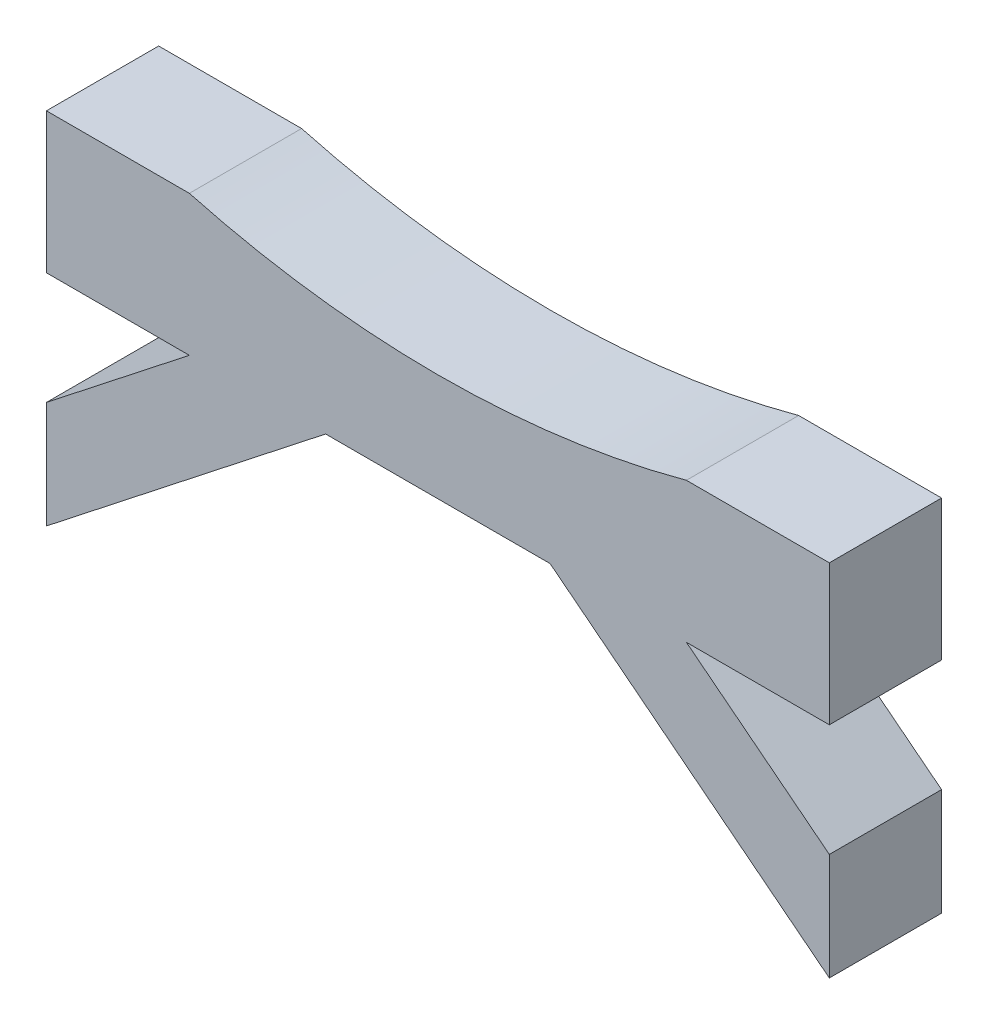
ISO-10303-21;
HEADER;
FILE_DESCRIPTION(('STEP AP214'),'2;1');
FILE_NAME('part.step','',(''),(''),'','','');
FILE_SCHEMA(('AUTOMOTIVE_DESIGN { 1 0 10303 214 1 1 1 1 }'));
ENDSEC;
DATA;
#1=APPLICATION_CONTEXT('core data for automotive mechanical design processes');
#2=APPLICATION_PROTOCOL_DEFINITION('international standard','automotive_design',2000,#1);
#3=PRODUCT_CONTEXT('',#1,'mechanical');
#4=PRODUCT('Part','Part','',(#3));
#5=PRODUCT_RELATED_PRODUCT_CATEGORY('part','',(#4));
#6=PRODUCT_DEFINITION_FORMATION('','',#4);
#7=PRODUCT_DEFINITION_CONTEXT('part definition',#1,'design');
#8=PRODUCT_DEFINITION('design','',#6,#7);
#9=PRODUCT_DEFINITION_SHAPE('','',#8);
#10=(LENGTH_UNIT() NAMED_UNIT(*) SI_UNIT(.MILLI.,.METRE.));
#11=(NAMED_UNIT(*) PLANE_ANGLE_UNIT() SI_UNIT($,.RADIAN.));
#12=(NAMED_UNIT(*) SI_UNIT($,.STERADIAN.) SOLID_ANGLE_UNIT());
#13=UNCERTAINTY_MEASURE_WITH_UNIT(LENGTH_MEASURE(1.E-05),#10,'distance_accuracy_value','');
#14=(GEOMETRIC_REPRESENTATION_CONTEXT(3) GLOBAL_UNCERTAINTY_ASSIGNED_CONTEXT((#13)) GLOBAL_UNIT_ASSIGNED_CONTEXT((#10,
#11,#12)) REPRESENTATION_CONTEXT('',''));
#15=CARTESIAN_POINT('',(0.,0.,0.));
#16=DIRECTION('',(0.,0.,1.));
#17=DIRECTION('',(1.,0.,0.));
#18=AXIS2_PLACEMENT_3D('',#15,#16,#17);
#19=CARTESIAN_POINT('',(0.,0.,5.08));
#20=DIRECTION('',(1.,0.,0.));
#21=DIRECTION('',(0.,0.,-1.));
#22=AXIS2_PLACEMENT_3D('',#19,#20,#21);
#23=PLANE('',#22);
#24=DIRECTION('',(0.,-1.,0.));
#25=VECTOR('',#24,1.);
#26=CARTESIAN_POINT('',(0.,0.,0.));
#27=LINE('',#26,#25);
#28=CARTESIAN_POINT('',(0.,6.35,0.));
#29=VERTEX_POINT('',#28);
#30=CARTESIAN_POINT('',(0.,0.,0.));
#31=VERTEX_POINT('',#30);
#32=EDGE_CURVE('E171',#29,#31,#27,.T.);
#33=ORIENTED_EDGE('',*,*,#32,.T.);
#34=DIRECTION('',(0.,0.,-1.));
#35=VECTOR('',#34,1.);
#36=CARTESIAN_POINT('',(0.,0.,5.08));
#37=LINE('',#36,#35);
#38=CARTESIAN_POINT('',(0.,0.,5.08));
#39=VERTEX_POINT('',#38);
#40=EDGE_CURVE('E11',#39,#31,#37,.T.);
#41=ORIENTED_EDGE('',*,*,#40,.F.);
#42=DIRECTION('',(0.,-1.,0.));
#43=VECTOR('',#42,1.);
#44=CARTESIAN_POINT('',(0.,0.,5.08));
#45=LINE('',#44,#43);
#46=CARTESIAN_POINT('',(0.,6.35,5.08));
#47=VERTEX_POINT('',#46);
#48=EDGE_CURVE('E197',#47,#39,#45,.T.);
#49=ORIENTED_EDGE('',*,*,#48,.F.);
#50=DIRECTION('',(0.,0.,-1.));
#51=VECTOR('',#50,1.);
#52=CARTESIAN_POINT('',(0.,6.35,5.08));
#53=LINE('',#52,#51);
#54=EDGE_CURVE('E167',#47,#29,#53,.T.);
#55=ORIENTED_EDGE('',*,*,#54,.T.);
#56=EDGE_LOOP('',(#33,#41,#49,#55));
#57=FACE_BOUND('',#56,.T.);
#58=ADVANCED_FACE('F39',(#57),#23,.F.);
#59=CARTESIAN_POINT('',(0.,0.,5.08));
#60=DIRECTION('',(0.,1.,0.));
#61=DIRECTION('',(0.,0.,1.));
#62=AXIS2_PLACEMENT_3D('',#59,#60,#61);
#63=PLANE('',#62);
#64=DIRECTION('',(1.,0.,0.));
#65=VECTOR('',#64,1.);
#66=CARTESIAN_POINT('',(0.,0.,0.));
#67=LINE('',#66,#65);
#68=CARTESIAN_POINT('',(6.46865976501453,0.,0.));
#69=VERTEX_POINT('',#68);
#70=EDGE_CURVE('E174',#31,#69,#67,.T.);
#71=ORIENTED_EDGE('',*,*,#70,.T.);
#72=DIRECTION('',(0.,0.,-1.));
#73=VECTOR('',#72,1.);
#74=CARTESIAN_POINT('',(6.46865976501453,0.,5.08));
#75=LINE('',#74,#73);
#76=CARTESIAN_POINT('',(6.46865976501453,0.,5.08));
#77=VERTEX_POINT('',#76);
#78=EDGE_CURVE('E47',#77,#69,#75,.T.);
#79=ORIENTED_EDGE('',*,*,#78,.F.);
#80=DIRECTION('',(1.,0.,0.));
#81=VECTOR('',#80,1.);
#82=CARTESIAN_POINT('',(0.,0.,5.08));
#83=LINE('',#82,#81);
#84=EDGE_CURVE('E116',#39,#77,#83,.T.);
#85=ORIENTED_EDGE('',*,*,#84,.F.);
#86=ORIENTED_EDGE('',*,*,#40,.T.);
#87=EDGE_LOOP('',(#71,#79,#85,#86));
#88=FACE_BOUND('',#87,.T.);
#89=ADVANCED_FACE('F285',(#88),#63,.F.);
#90=CARTESIAN_POINT('',(6.46865976501453,0.,5.08));
#91=DIRECTION('',(0.617632218830328,-0.786467063685903,0.));
#92=DIRECTION('',(0.786467063685903,0.617632218830328,0.));
#93=AXIS2_PLACEMENT_3D('',#90,#91,#92);
#94=PLANE('',#93);
#95=DIRECTION('',(-0.786467063685903,-0.617632218830328,0.));
#96=VECTOR('',#95,1.);
#97=CARTESIAN_POINT('',(6.46865976501453,0.,0.));
#98=LINE('',#97,#96);
#99=CARTESIAN_POINT('',(0.,-5.08,0.));
#100=VERTEX_POINT('',#99);
#101=EDGE_CURVE('E176',#69,#100,#98,.T.);
#102=ORIENTED_EDGE('',*,*,#101,.T.);
#103=DIRECTION('',(0.,0.,-1.));
#104=VECTOR('',#103,1.);
#105=CARTESIAN_POINT('',(0.,-5.08,5.08));
#106=LINE('',#105,#104);
#107=CARTESIAN_POINT('',(0.,-5.08,5.08));
#108=VERTEX_POINT('',#107);
#109=EDGE_CURVE('E222',#108,#100,#106,.T.);
#110=ORIENTED_EDGE('',*,*,#109,.F.);
#111=DIRECTION('',(-0.786467063685903,-0.617632218830328,0.));
#112=VECTOR('',#111,1.);
#113=CARTESIAN_POINT('',(6.46865976501453,0.,5.08));
#114=LINE('',#113,#112);
#115=EDGE_CURVE('E230',#77,#108,#114,.T.);
#116=ORIENTED_EDGE('',*,*,#115,.F.);
#117=ORIENTED_EDGE('',*,*,#78,.T.);
#118=EDGE_LOOP('',(#102,#110,#116,#117));
#119=FACE_BOUND('',#118,.T.);
#120=ADVANCED_FACE('F228',(#119),#94,.F.);
#121=CARTESIAN_POINT('',(0.,-5.08,5.08));
#122=DIRECTION('',(1.,0.,0.));
#123=DIRECTION('',(0.,1.,0.));
#124=AXIS2_PLACEMENT_3D('',#121,#122,#123);
#125=PLANE('',#124);
#126=DIRECTION('',(0.,-1.,0.));
#127=VECTOR('',#126,1.);
#128=CARTESIAN_POINT('',(0.,-5.08,0.));
#129=LINE('',#128,#127);
#130=CARTESIAN_POINT('',(0.,-9.92444953377174,0.));
#131=VERTEX_POINT('',#130);
#132=EDGE_CURVE('E178',#100,#131,#129,.T.);
#133=ORIENTED_EDGE('',*,*,#132,.T.);
#134=DIRECTION('',(0.,0.,-1.));
#135=VECTOR('',#134,1.);
#136=CARTESIAN_POINT('',(0.,-9.92444953377174,5.08));
#137=LINE('',#136,#135);
#138=CARTESIAN_POINT('',(0.,-9.92444953377174,5.08));
#139=VERTEX_POINT('',#138);
#140=EDGE_CURVE('E219',#139,#131,#137,.T.);
#141=ORIENTED_EDGE('',*,*,#140,.F.);
#142=DIRECTION('',(0.,-1.,0.));
#143=VECTOR('',#142,1.);
#144=CARTESIAN_POINT('',(0.,-5.08,5.08));
#145=LINE('',#144,#143);
#146=EDGE_CURVE('E248',#108,#139,#145,.T.);
#147=ORIENTED_EDGE('',*,*,#146,.F.);
#148=ORIENTED_EDGE('',*,*,#109,.T.);
#149=EDGE_LOOP('',(#133,#141,#147,#148));
#150=FACE_BOUND('',#149,.T.);
#151=ADVANCED_FACE('F239',(#150),#125,.F.);
#152=CARTESIAN_POINT('',(0.,-9.92444953377174,5.08));
#153=DIRECTION('',(-0.617632218830328,0.786467063685903,0.));
#154=DIRECTION('',(-0.786467063685903,-0.617632218830328,0.));
#155=AXIS2_PLACEMENT_3D('',#152,#153,#154);
#156=PLANE('',#155);
#157=DIRECTION('',(0.786467063685903,0.617632218830327,0.));
#158=VECTOR('',#157,1.);
#159=CARTESIAN_POINT('',(0.,-9.92444953377174,0.));
#160=LINE('',#159,#158);
#161=CARTESIAN_POINT('',(12.6373794072887,0.,0.));
#162=VERTEX_POINT('',#161);
#163=EDGE_CURVE('E180',#131,#162,#160,.T.);
#164=ORIENTED_EDGE('',*,*,#163,.T.);
#165=DIRECTION('',(0.,0.,-1.));
#166=VECTOR('',#165,1.);
#167=CARTESIAN_POINT('',(12.6373794072887,0.,5.08));
#168=LINE('',#167,#166);
#169=CARTESIAN_POINT('',(12.6373794072887,0.,5.08));
#170=VERTEX_POINT('',#169);
#171=EDGE_CURVE('E216',#170,#162,#168,.T.);
#172=ORIENTED_EDGE('',*,*,#171,.F.);
#173=DIRECTION('',(0.786467063685903,0.617632218830327,0.));
#174=VECTOR('',#173,1.);
#175=CARTESIAN_POINT('',(0.,-9.92444953377174,5.08));
#176=LINE('',#175,#174);
#177=EDGE_CURVE('E245',#139,#170,#176,.T.);
#178=ORIENTED_EDGE('',*,*,#177,.F.);
#179=ORIENTED_EDGE('',*,*,#140,.T.);
#180=EDGE_LOOP('',(#164,#172,#178,#179));
#181=FACE_BOUND('',#180,.T.);
#182=ADVANCED_FACE('F243',(#181),#156,.F.);
#183=CARTESIAN_POINT('',(12.6373794072887,0.,5.08));
#184=DIRECTION('',(0.,1.,0.));
#185=DIRECTION('',(0.,0.,1.));
#186=AXIS2_PLACEMENT_3D('',#183,#184,#185);
#187=PLANE('',#186);
#188=DIRECTION('',(1.,0.,0.));
#189=VECTOR('',#188,1.);
#190=CARTESIAN_POINT('',(12.6373794072887,0.,0.));
#191=LINE('',#190,#189);
#192=CARTESIAN_POINT('',(22.7973794072887,0.,0.));
#193=VERTEX_POINT('',#192);
#194=EDGE_CURVE('E182',#162,#193,#191,.T.);
#195=ORIENTED_EDGE('',*,*,#194,.T.);
#196=DIRECTION('',(0.,0.,-1.));
#197=VECTOR('',#196,1.);
#198=CARTESIAN_POINT('',(22.7973794072887,0.,5.08));
#199=LINE('',#198,#197);
#200=CARTESIAN_POINT('',(22.7973794072887,0.,5.08));
#201=VERTEX_POINT('',#200);
#202=EDGE_CURVE('E213',#201,#193,#199,.T.);
#203=ORIENTED_EDGE('',*,*,#202,.F.);
#204=DIRECTION('',(1.,0.,0.));
#205=VECTOR('',#204,1.);
#206=CARTESIAN_POINT('',(12.6373794072887,0.,5.08));
#207=LINE('',#206,#205);
#208=EDGE_CURVE('E247',#170,#201,#207,.T.);
#209=ORIENTED_EDGE('',*,*,#208,.F.);
#210=ORIENTED_EDGE('',*,*,#171,.T.);
#211=EDGE_LOOP('',(#195,#203,#209,#210));
#212=FACE_BOUND('',#211,.T.);
#213=ADVANCED_FACE('F298',(#212),#187,.F.);
#214=CARTESIAN_POINT('',(35.4347588145773,-9.92444953377174,5.08));
#215=DIRECTION('',(0.617632218830327,0.786467063685903,0.));
#216=DIRECTION('',(-0.786467063685903,0.617632218830327,0.));
#217=AXIS2_PLACEMENT_3D('',#214,#215,#216);
#218=PLANE('',#217);
#219=DIRECTION('',(0.786467063685903,-0.617632218830328,0.));
#220=VECTOR('',#219,1.);
#221=CARTESIAN_POINT('',(35.4347588145773,-9.92444953377174,0.));
#222=LINE('',#221,#220);
#223=CARTESIAN_POINT('',(35.4347588145773,-9.92444953377174,0.));
#224=VERTEX_POINT('',#223);
#225=EDGE_CURVE('E184',#193,#224,#222,.T.);
#226=ORIENTED_EDGE('',*,*,#225,.T.);
#227=DIRECTION('',(0.,0.,-1.));
#228=VECTOR('',#227,1.);
#229=CARTESIAN_POINT('',(35.4347588145773,-9.92444953377174,5.08));
#230=LINE('',#229,#228);
#231=CARTESIAN_POINT('',(35.4347588145773,-9.92444953377174,5.08));
#232=VERTEX_POINT('',#231);
#233=EDGE_CURVE('E210',#232,#224,#230,.T.);
#234=ORIENTED_EDGE('',*,*,#233,.F.);
#235=DIRECTION('',(0.786467063685903,-0.617632218830328,0.));
#236=VECTOR('',#235,1.);
#237=CARTESIAN_POINT('',(35.4347588145773,-9.92444953377174,5.08));
#238=LINE('',#237,#236);
#239=EDGE_CURVE('E250',#201,#232,#238,.T.);
#240=ORIENTED_EDGE('',*,*,#239,.F.);
#241=ORIENTED_EDGE('',*,*,#202,.T.);
#242=EDGE_LOOP('',(#226,#234,#240,#241));
#243=FACE_BOUND('',#242,.T.);
#244=ADVANCED_FACE('F301',(#243),#218,.F.);
#245=CARTESIAN_POINT('',(35.4347588145773,-5.08,5.08));
#246=DIRECTION('',(-1.,0.,0.));
#247=DIRECTION('',(0.,0.,1.));
#248=AXIS2_PLACEMENT_3D('',#245,#246,#247);
#249=PLANE('',#248);
#250=DIRECTION('',(0.,1.,0.));
#251=VECTOR('',#250,1.);
#252=CARTESIAN_POINT('',(35.4347588145773,-5.08,0.));
#253=LINE('',#252,#251);
#254=CARTESIAN_POINT('',(35.4347588145773,-5.08,0.));
#255=VERTEX_POINT('',#254);
#256=EDGE_CURVE('E186',#224,#255,#253,.T.);
#257=ORIENTED_EDGE('',*,*,#256,.T.);
#258=DIRECTION('',(0.,0.,-1.));
#259=VECTOR('',#258,1.);
#260=CARTESIAN_POINT('',(35.4347588145773,-5.08,5.08));
#261=LINE('',#260,#259);
#262=CARTESIAN_POINT('',(35.4347588145773,-5.08,5.08));
#263=VERTEX_POINT('',#262);
#264=EDGE_CURVE('E207',#263,#255,#261,.T.);
#265=ORIENTED_EDGE('',*,*,#264,.F.);
#266=DIRECTION('',(0.,1.,0.));
#267=VECTOR('',#266,1.);
#268=CARTESIAN_POINT('',(35.4347588145773,-5.08,5.08));
#269=LINE('',#268,#267);
#270=EDGE_CURVE('E256',#232,#263,#269,.T.);
#271=ORIENTED_EDGE('',*,*,#270,.F.);
#272=ORIENTED_EDGE('',*,*,#233,.T.);
#273=EDGE_LOOP('',(#257,#265,#271,#272));
#274=FACE_BOUND('',#273,.T.);
#275=ADVANCED_FACE('F305',(#274),#249,.F.);
#276=CARTESIAN_POINT('',(28.9660990495628,0.,5.08));
#277=DIRECTION('',(-0.617632218830328,-0.786467063685903,0.));
#278=DIRECTION('',(0.786467063685903,-0.617632218830328,0.));
#279=AXIS2_PLACEMENT_3D('',#276,#277,#278);
#280=PLANE('',#279);
#281=DIRECTION('',(-0.786467063685903,0.617632218830328,0.));
#282=VECTOR('',#281,1.);
#283=CARTESIAN_POINT('',(28.9660990495628,0.,0.));
#284=LINE('',#283,#282);
#285=CARTESIAN_POINT('',(28.9660990495628,0.,0.));
#286=VERTEX_POINT('',#285);
#287=EDGE_CURVE('E188',#255,#286,#284,.T.);
#288=ORIENTED_EDGE('',*,*,#287,.T.);
#289=DIRECTION('',(0.,0.,-1.));
#290=VECTOR('',#289,1.);
#291=CARTESIAN_POINT('',(28.9660990495628,0.,5.08));
#292=LINE('',#291,#290);
#293=CARTESIAN_POINT('',(28.9660990495628,0.,5.08));
#294=VERTEX_POINT('',#293);
#295=EDGE_CURVE('E204',#294,#286,#292,.T.);
#296=ORIENTED_EDGE('',*,*,#295,.F.);
#297=DIRECTION('',(-0.786467063685903,0.617632218830328,0.));
#298=VECTOR('',#297,1.);
#299=CARTESIAN_POINT('',(28.9660990495628,0.,5.08));
#300=LINE('',#299,#298);
#301=EDGE_CURVE('E258',#263,#294,#300,.T.);
#302=ORIENTED_EDGE('',*,*,#301,.F.);
#303=ORIENTED_EDGE('',*,*,#264,.T.);
#304=EDGE_LOOP('',(#288,#296,#302,#303));
#305=FACE_BOUND('',#304,.T.);
#306=ADVANCED_FACE('F309',(#305),#280,.F.);
#307=CARTESIAN_POINT('',(35.4347588145773,0.,5.08));
#308=DIRECTION('',(0.,1.,0.));
#309=DIRECTION('',(0.,0.,1.));
#310=AXIS2_PLACEMENT_3D('',#307,#308,#309);
#311=PLANE('',#310);
#312=DIRECTION('',(1.,0.,0.));
#313=VECTOR('',#312,1.);
#314=CARTESIAN_POINT('',(35.4347588145773,0.,0.));
#315=LINE('',#314,#313);
#316=CARTESIAN_POINT('',(35.4347588145773,0.,0.));
#317=VERTEX_POINT('',#316);
#318=EDGE_CURVE('E190',#286,#317,#315,.T.);
#319=ORIENTED_EDGE('',*,*,#318,.T.);
#320=DIRECTION('',(0.,0.,-1.));
#321=VECTOR('',#320,1.);
#322=CARTESIAN_POINT('',(35.4347588145773,0.,5.08));
#323=LINE('',#322,#321);
#324=CARTESIAN_POINT('',(35.4347588145773,0.,5.08));
#325=VERTEX_POINT('',#324);
#326=EDGE_CURVE('E201',#325,#317,#323,.T.);
#327=ORIENTED_EDGE('',*,*,#326,.F.);
#328=DIRECTION('',(1.,0.,0.));
#329=VECTOR('',#328,1.);
#330=CARTESIAN_POINT('',(35.4347588145773,0.,5.08));
#331=LINE('',#330,#329);
#332=EDGE_CURVE('E260',#294,#325,#331,.T.);
#333=ORIENTED_EDGE('',*,*,#332,.F.);
#334=ORIENTED_EDGE('',*,*,#295,.T.);
#335=EDGE_LOOP('',(#319,#327,#333,#334));
#336=FACE_BOUND('',#335,.T.);
#337=ADVANCED_FACE('F266',(#336),#311,.F.);
#338=CARTESIAN_POINT('',(35.4347588145773,0.,5.08));
#339=DIRECTION('',(-1.,0.,0.));
#340=DIRECTION('',(0.,0.,1.));
#341=AXIS2_PLACEMENT_3D('',#338,#339,#340);
#342=PLANE('',#341);
#343=DIRECTION('',(0.,1.,0.));
#344=VECTOR('',#343,1.);
#345=CARTESIAN_POINT('',(35.4347588145773,0.,0.));
#346=LINE('',#345,#344);
#347=CARTESIAN_POINT('',(35.4347588145773,6.35,0.));
#348=VERTEX_POINT('',#347);
#349=EDGE_CURVE('E192',#317,#348,#346,.T.);
#350=ORIENTED_EDGE('',*,*,#349,.T.);
#351=DIRECTION('',(0.,0.,-1.));
#352=VECTOR('',#351,1.);
#353=CARTESIAN_POINT('',(35.4347588145773,6.35,5.08));
#354=LINE('',#353,#352);
#355=CARTESIAN_POINT('',(35.4347588145773,6.35,5.08));
#356=VERTEX_POINT('',#355);
#357=EDGE_CURVE('E162',#356,#348,#354,.T.);
#358=ORIENTED_EDGE('',*,*,#357,.F.);
#359=DIRECTION('',(0.,1.,0.));
#360=VECTOR('',#359,1.);
#361=CARTESIAN_POINT('',(35.4347588145773,0.,5.08));
#362=LINE('',#361,#360);
#363=EDGE_CURVE('E153',#325,#356,#362,.T.);
#364=ORIENTED_EDGE('',*,*,#363,.F.);
#365=ORIENTED_EDGE('',*,*,#326,.T.);
#366=EDGE_LOOP('',(#350,#358,#364,#365));
#367=FACE_BOUND('',#366,.T.);
#368=ADVANCED_FACE('F270',(#367),#342,.F.);
#369=CARTESIAN_POINT('',(28.9660990495628,6.35,5.08));
#370=DIRECTION('',(0.,-1.,0.));
#371=DIRECTION('',(0.,0.,-1.));
#372=AXIS2_PLACEMENT_3D('',#369,#370,#371);
#373=PLANE('',#372);
#374=DIRECTION('',(-1.,0.,0.));
#375=VECTOR('',#374,1.);
#376=CARTESIAN_POINT('',(28.9660990495628,6.35,0.));
#377=LINE('',#376,#375);
#378=CARTESIAN_POINT('',(28.9660990495628,6.35,0.));
#379=VERTEX_POINT('',#378);
#380=EDGE_CURVE('E161',#348,#379,#377,.T.);
#381=ORIENTED_EDGE('',*,*,#380,.T.);
#382=DIRECTION('',(0.,0.,-1.));
#383=VECTOR('',#382,1.);
#384=CARTESIAN_POINT('',(28.9660990495628,6.35,5.08));
#385=LINE('',#384,#383);
#386=CARTESIAN_POINT('',(28.9660990495628,6.35,5.08));
#387=VERTEX_POINT('',#386);
#388=EDGE_CURVE('E158',#387,#379,#385,.T.);
#389=ORIENTED_EDGE('',*,*,#388,.F.);
#390=DIRECTION('',(-1.,0.,0.));
#391=VECTOR('',#390,1.);
#392=CARTESIAN_POINT('',(28.9660990495628,6.35,5.08));
#393=LINE('',#392,#391);
#394=EDGE_CURVE('E147',#356,#387,#393,.T.);
#395=ORIENTED_EDGE('',*,*,#394,.F.);
#396=ORIENTED_EDGE('',*,*,#357,.T.);
#397=EDGE_LOOP('',(#381,#389,#395,#396));
#398=FACE_BOUND('',#397,.T.);
#399=ADVANCED_FACE('F159',(#398),#373,.F.);
#400=CARTESIAN_POINT('',(17.7173794072887,48.0390717863749,5.08));
#401=DIRECTION('',(0.,0.,-1.));
#402=DIRECTION('',(-1.,0.,0.));
#403=AXIS2_PLACEMENT_3D('',#400,#401,#402);
#404=CYLINDRICAL_SURFACE('',#403,43.18);
#405=CARTESIAN_POINT('',(17.7173794072887,48.0390717863749,0.));
#406=DIRECTION('',(0.,0.,-1.));
#407=DIRECTION('',(1.,0.,0.));
#408=AXIS2_PLACEMENT_3D('',#405,#406,#407);
#409=CIRCLE('',#408,43.18);
#410=CARTESIAN_POINT('',(6.4686597650145,6.35000000000002,0.));
#411=VERTEX_POINT('',#410);
#412=EDGE_CURVE('E102',#379,#411,#409,.T.);
#413=ORIENTED_EDGE('',*,*,#412,.T.);
#414=DIRECTION('',(0.,0.,-1.));
#415=VECTOR('',#414,1.);
#416=CARTESIAN_POINT('',(6.4686597650145,6.35000000000002,5.08));
#417=LINE('',#416,#415);
#418=CARTESIAN_POINT('',(6.4686597650145,6.35000000000002,5.08));
#419=VERTEX_POINT('',#418);
#420=EDGE_CURVE('E163',#419,#411,#417,.T.);
#421=ORIENTED_EDGE('',*,*,#420,.F.);
#422=CARTESIAN_POINT('',(17.7173794072887,48.0390717863749,5.08));
#423=DIRECTION('',(0.,0.,-1.));
#424=DIRECTION('',(1.,0.,0.));
#425=AXIS2_PLACEMENT_3D('',#422,#423,#424);
#426=CIRCLE('',#425,43.18);
#427=EDGE_CURVE('E151',#387,#419,#426,.T.);
#428=ORIENTED_EDGE('',*,*,#427,.F.);
#429=ORIENTED_EDGE('',*,*,#388,.T.);
#430=EDGE_LOOP('',(#413,#421,#428,#429));
#431=FACE_BOUND('',#430,.T.);
#432=ADVANCED_FACE('F165',(#431),#404,.F.);
#433=CARTESIAN_POINT('',(0.,6.35,5.08));
#434=DIRECTION('',(0.,-1.,0.));
#435=DIRECTION('',(0.,0.,-1.));
#436=AXIS2_PLACEMENT_3D('',#433,#434,#435);
#437=PLANE('',#436);
#438=DIRECTION('',(-1.,0.,0.));
#439=VECTOR('',#438,1.);
#440=CARTESIAN_POINT('',(0.,6.35,0.));
#441=LINE('',#440,#439);
#442=EDGE_CURVE('E108',#411,#29,#441,.T.);
#443=ORIENTED_EDGE('',*,*,#442,.T.);
#444=ORIENTED_EDGE('',*,*,#54,.F.);
#445=DIRECTION('',(-1.,0.,0.));
#446=VECTOR('',#445,1.);
#447=CARTESIAN_POINT('',(0.,6.35,5.08));
#448=LINE('',#447,#446);
#449=EDGE_CURVE('E55',#419,#47,#448,.T.);
#450=ORIENTED_EDGE('',*,*,#449,.F.);
#451=ORIENTED_EDGE('',*,*,#420,.T.);
#452=EDGE_LOOP('',(#443,#444,#450,#451));
#453=FACE_BOUND('',#452,.T.);
#454=ADVANCED_FACE('F274',(#453),#437,.F.);
#455=CARTESIAN_POINT('',(17.7173794072887,48.0390717863749,5.08));
#456=DIRECTION('',(0.,0.,1.));
#457=DIRECTION('',(1.,0.,0.));
#458=AXIS2_PLACEMENT_3D('',#455,#456,#457);
#459=PLANE('',#458);
#460=ORIENTED_EDGE('',*,*,#48,.T.);
#461=ORIENTED_EDGE('',*,*,#84,.T.);
#462=ORIENTED_EDGE('',*,*,#115,.T.);
#463=ORIENTED_EDGE('',*,*,#146,.T.);
#464=ORIENTED_EDGE('',*,*,#177,.T.);
#465=ORIENTED_EDGE('',*,*,#208,.T.);
#466=ORIENTED_EDGE('',*,*,#239,.T.);
#467=ORIENTED_EDGE('',*,*,#270,.T.);
#468=ORIENTED_EDGE('',*,*,#301,.T.);
#469=ORIENTED_EDGE('',*,*,#332,.T.);
#470=ORIENTED_EDGE('',*,*,#363,.T.);
#471=ORIENTED_EDGE('',*,*,#394,.T.);
#472=ORIENTED_EDGE('',*,*,#427,.T.);
#473=ORIENTED_EDGE('',*,*,#449,.T.);
#474=EDGE_LOOP('',(#460,#461,#462,#463,#464,#465,#466,#467,#468,#469,#470,#471,#472,#473));
#475=FACE_BOUND('',#474,.T.);
#476=ADVANCED_FACE('F149',(#475),#459,.T.);
#477=CARTESIAN_POINT('',(17.7173794072887,48.0390717863749,0.));
#478=DIRECTION('',(0.,0.,1.));
#479=DIRECTION('',(1.,0.,0.));
#480=AXIS2_PLACEMENT_3D('',#477,#478,#479);
#481=PLANE('',#480);
#482=ORIENTED_EDGE('',*,*,#32,.F.);
#483=ORIENTED_EDGE('',*,*,#442,.F.);
#484=ORIENTED_EDGE('',*,*,#412,.F.);
#485=ORIENTED_EDGE('',*,*,#380,.F.);
#486=ORIENTED_EDGE('',*,*,#349,.F.);
#487=ORIENTED_EDGE('',*,*,#318,.F.);
#488=ORIENTED_EDGE('',*,*,#287,.F.);
#489=ORIENTED_EDGE('',*,*,#256,.F.);
#490=ORIENTED_EDGE('',*,*,#225,.F.);
#491=ORIENTED_EDGE('',*,*,#194,.F.);
#492=ORIENTED_EDGE('',*,*,#163,.F.);
#493=ORIENTED_EDGE('',*,*,#132,.F.);
#494=ORIENTED_EDGE('',*,*,#101,.F.);
#495=ORIENTED_EDGE('',*,*,#70,.F.);
#496=EDGE_LOOP('',(#482,#483,#484,#485,#486,#487,#488,#489,#490,#491,#492,#493,#494,#495));
#497=FACE_BOUND('',#496,.T.);
#498=ADVANCED_FACE('F234',(#497),#481,.F.);
#499=CLOSED_SHELL('',(#58,#89,#120,#151,#182,#213,#244,#275,#306,#337,#368,#399,#432,#454,#476,#498));
#500=MANIFOLD_SOLID_BREP('B2',#499);
#501=ADVANCED_BREP_SHAPE_REPRESENTATION('',(#18,#500),#14);
#502=SHAPE_DEFINITION_REPRESENTATION(#9,#501);
ENDSEC;
END-ISO-10303-21;
